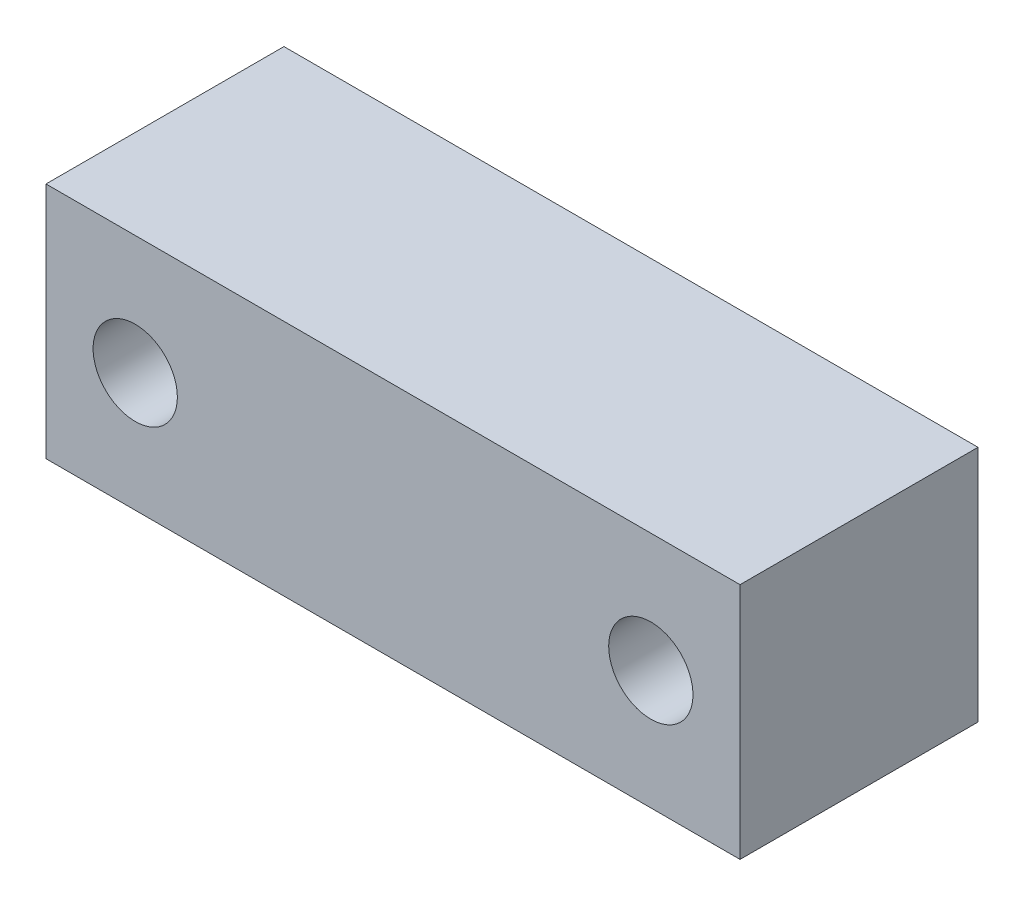
ISO-10303-21;
HEADER;
FILE_DESCRIPTION(('STEP AP214'),'2;1');
FILE_NAME('part.step','',(''),(''),'','','');
FILE_SCHEMA(('AUTOMOTIVE_DESIGN { 1 0 10303 214 1 1 1 1 }'));
ENDSEC;
DATA;
#1=APPLICATION_CONTEXT('core data for automotive mechanical design processes');
#2=APPLICATION_PROTOCOL_DEFINITION('international standard','automotive_design',2000,#1);
#3=PRODUCT_CONTEXT('',#1,'mechanical');
#4=PRODUCT('Part','Part','',(#3));
#5=PRODUCT_RELATED_PRODUCT_CATEGORY('part','',(#4));
#6=PRODUCT_DEFINITION_FORMATION('','',#4);
#7=PRODUCT_DEFINITION_CONTEXT('part definition',#1,'design');
#8=PRODUCT_DEFINITION('design','',#6,#7);
#9=PRODUCT_DEFINITION_SHAPE('','',#8);
#10=(LENGTH_UNIT() NAMED_UNIT(*) SI_UNIT(.MILLI.,.METRE.));
#11=(NAMED_UNIT(*) PLANE_ANGLE_UNIT() SI_UNIT($,.RADIAN.));
#12=(NAMED_UNIT(*) SI_UNIT($,.STERADIAN.) SOLID_ANGLE_UNIT());
#13=UNCERTAINTY_MEASURE_WITH_UNIT(LENGTH_MEASURE(1.E-05),#10,'distance_accuracy_value','');
#14=(GEOMETRIC_REPRESENTATION_CONTEXT(3) GLOBAL_UNCERTAINTY_ASSIGNED_CONTEXT((#13)) GLOBAL_UNIT_ASSIGNED_CONTEXT((#10,
#11,#12)) REPRESENTATION_CONTEXT('',''));
#15=CARTESIAN_POINT('',(0.,0.,0.));
#16=DIRECTION('',(0.,0.,1.));
#17=DIRECTION('',(1.,0.,0.));
#18=AXIS2_PLACEMENT_3D('',#15,#16,#17);
#19=CARTESIAN_POINT('',(0.,0.,24.));
#20=DIRECTION('',(1.,0.,0.));
#21=DIRECTION('',(0.,0.,-1.));
#22=AXIS2_PLACEMENT_3D('',#19,#20,#21);
#23=PLANE('',#22);
#24=DIRECTION('',(0.,-1.,0.));
#25=VECTOR('',#24,1.);
#26=CARTESIAN_POINT('',(0.,0.,0.));
#27=LINE('',#26,#25);
#28=CARTESIAN_POINT('',(0.,24.,0.));
#29=VERTEX_POINT('',#28);
#30=CARTESIAN_POINT('',(0.,0.,0.));
#31=VERTEX_POINT('',#30);
#32=EDGE_CURVE('E96',#29,#31,#27,.T.);
#33=ORIENTED_EDGE('',*,*,#32,.T.);
#34=DIRECTION('',(0.,0.,-1.));
#35=VECTOR('',#34,1.);
#36=CARTESIAN_POINT('',(0.,0.,24.));
#37=LINE('',#36,#35);
#38=CARTESIAN_POINT('',(0.,0.,24.));
#39=VERTEX_POINT('',#38);
#40=EDGE_CURVE('E11',#39,#31,#37,.T.);
#41=ORIENTED_EDGE('',*,*,#40,.F.);
#42=DIRECTION('',(0.,-1.,0.));
#43=VECTOR('',#42,1.);
#44=CARTESIAN_POINT('',(0.,0.,24.));
#45=LINE('',#44,#43);
#46=CARTESIAN_POINT('',(0.,24.,24.));
#47=VERTEX_POINT('',#46);
#48=EDGE_CURVE('E84',#47,#39,#45,.T.);
#49=ORIENTED_EDGE('',*,*,#48,.F.);
#50=DIRECTION('',(0.,0.,-1.));
#51=VECTOR('',#50,1.);
#52=CARTESIAN_POINT('',(0.,24.,24.));
#53=LINE('',#52,#51);
#54=EDGE_CURVE('E92',#47,#29,#53,.T.);
#55=ORIENTED_EDGE('',*,*,#54,.T.);
#56=EDGE_LOOP('',(#33,#41,#49,#55));
#57=FACE_BOUND('',#56,.T.);
#58=ADVANCED_FACE('F33',(#57),#23,.F.);
#59=CARTESIAN_POINT('',(0.,0.,24.));
#60=DIRECTION('',(0.,1.,0.));
#61=DIRECTION('',(0.,0.,1.));
#62=AXIS2_PLACEMENT_3D('',#59,#60,#61);
#63=PLANE('',#62);
#64=DIRECTION('',(1.,0.,0.));
#65=VECTOR('',#64,1.);
#66=CARTESIAN_POINT('',(0.,0.,0.));
#67=LINE('',#66,#65);
#68=CARTESIAN_POINT('',(70.,0.,0.));
#69=VERTEX_POINT('',#68);
#70=EDGE_CURVE('E88',#31,#69,#67,.T.);
#71=ORIENTED_EDGE('',*,*,#70,.T.);
#72=DIRECTION('',(0.,0.,-1.));
#73=VECTOR('',#72,1.);
#74=CARTESIAN_POINT('',(70.,0.,24.));
#75=LINE('',#74,#73);
#76=CARTESIAN_POINT('',(70.,0.,24.));
#77=VERTEX_POINT('',#76);
#78=EDGE_CURVE('E41',#77,#69,#75,.T.);
#79=ORIENTED_EDGE('',*,*,#78,.F.);
#80=DIRECTION('',(1.,0.,0.));
#81=VECTOR('',#80,1.);
#82=CARTESIAN_POINT('',(0.,0.,24.));
#83=LINE('',#82,#81);
#84=EDGE_CURVE('E79',#39,#77,#83,.T.);
#85=ORIENTED_EDGE('',*,*,#84,.F.);
#86=ORIENTED_EDGE('',*,*,#40,.T.);
#87=EDGE_LOOP('',(#71,#79,#85,#86));
#88=FACE_BOUND('',#87,.T.);
#89=ADVANCED_FACE('F87',(#88),#63,.F.);
#90=CARTESIAN_POINT('',(70.,0.,24.));
#91=DIRECTION('',(-1.,0.,0.));
#92=DIRECTION('',(0.,0.,1.));
#93=AXIS2_PLACEMENT_3D('',#90,#91,#92);
#94=PLANE('',#93);
#95=DIRECTION('',(0.,1.,0.));
#96=VECTOR('',#95,1.);
#97=CARTESIAN_POINT('',(70.,0.,0.));
#98=LINE('',#97,#96);
#99=CARTESIAN_POINT('',(70.,24.,0.));
#100=VERTEX_POINT('',#99);
#101=EDGE_CURVE('E66',#69,#100,#98,.T.);
#102=ORIENTED_EDGE('',*,*,#101,.T.);
#103=DIRECTION('',(0.,0.,-1.));
#104=VECTOR('',#103,1.);
#105=CARTESIAN_POINT('',(70.,24.,24.));
#106=LINE('',#105,#104);
#107=CARTESIAN_POINT('',(70.,24.,24.));
#108=VERTEX_POINT('',#107);
#109=EDGE_CURVE('E89',#108,#100,#106,.T.);
#110=ORIENTED_EDGE('',*,*,#109,.F.);
#111=DIRECTION('',(0.,1.,0.));
#112=VECTOR('',#111,1.);
#113=CARTESIAN_POINT('',(70.,0.,24.));
#114=LINE('',#113,#112);
#115=EDGE_CURVE('E82',#77,#108,#114,.T.);
#116=ORIENTED_EDGE('',*,*,#115,.F.);
#117=ORIENTED_EDGE('',*,*,#78,.T.);
#118=EDGE_LOOP('',(#102,#110,#116,#117));
#119=FACE_BOUND('',#118,.T.);
#120=ADVANCED_FACE('F90',(#119),#94,.F.);
#121=CARTESIAN_POINT('',(0.,24.,24.));
#122=DIRECTION('',(0.,-1.,0.));
#123=DIRECTION('',(0.,0.,-1.));
#124=AXIS2_PLACEMENT_3D('',#121,#122,#123);
#125=PLANE('',#124);
#126=DIRECTION('',(-1.,0.,0.));
#127=VECTOR('',#126,1.);
#128=CARTESIAN_POINT('',(0.,24.,0.));
#129=LINE('',#128,#127);
#130=EDGE_CURVE('E72',#100,#29,#129,.T.);
#131=ORIENTED_EDGE('',*,*,#130,.T.);
#132=ORIENTED_EDGE('',*,*,#54,.F.);
#133=DIRECTION('',(-1.,0.,0.));
#134=VECTOR('',#133,1.);
#135=CARTESIAN_POINT('',(0.,24.,24.));
#136=LINE('',#135,#134);
#137=EDGE_CURVE('E49',#108,#47,#136,.T.);
#138=ORIENTED_EDGE('',*,*,#137,.F.);
#139=ORIENTED_EDGE('',*,*,#109,.T.);
#140=EDGE_LOOP('',(#131,#132,#138,#139));
#141=FACE_BOUND('',#140,.T.);
#142=ADVANCED_FACE('F104',(#141),#125,.F.);
#143=CARTESIAN_POINT('',(0.,24.,24.));
#144=DIRECTION('',(0.,0.,-1.));
#145=DIRECTION('',(-1.,0.,0.));
#146=AXIS2_PLACEMENT_3D('',#143,#144,#145);
#147=PLANE('',#146);
#148=CARTESIAN_POINT('',(61.,12.,24.));
#149=DIRECTION('',(0.,0.,1.));
#150=DIRECTION('',(-1.,0.,0.));
#151=AXIS2_PLACEMENT_3D('',#148,#149,#150);
#152=CIRCLE('',#151,4.25000000000001);
#153=CARTESIAN_POINT('',(56.75,12.,24.));
#154=VERTEX_POINT('',#153);
#155=EDGE_CURVE('E116',#154,#154,#152,.T.);
#156=ORIENTED_EDGE('',*,*,#155,.F.);
#157=EDGE_LOOP('',(#156));
#158=FACE_BOUND('',#157,.T.);
#159=CARTESIAN_POINT('',(9.00000000000001,12.,24.));
#160=DIRECTION('',(0.,0.,1.));
#161=DIRECTION('',(1.,0.,0.));
#162=AXIS2_PLACEMENT_3D('',#159,#160,#161);
#163=CIRCLE('',#162,4.25);
#164=CARTESIAN_POINT('',(13.25,12.,24.));
#165=VERTEX_POINT('',#164);
#166=EDGE_CURVE('E110',#165,#165,#163,.T.);
#167=ORIENTED_EDGE('',*,*,#166,.F.);
#168=EDGE_LOOP('',(#167));
#169=FACE_BOUND('',#168,.T.);
#170=ORIENTED_EDGE('',*,*,#48,.T.);
#171=ORIENTED_EDGE('',*,*,#84,.T.);
#172=ORIENTED_EDGE('',*,*,#115,.T.);
#173=ORIENTED_EDGE('',*,*,#137,.T.);
#174=EDGE_LOOP('',(#170,#171,#172,#173));
#175=FACE_BOUND('',#174,.T.);
#176=ADVANCED_FACE('F80',(#158,#169,#175),#147,.F.);
#177=CARTESIAN_POINT('',(0.,24.,0.));
#178=DIRECTION('',(0.,0.,-1.));
#179=DIRECTION('',(-1.,0.,0.));
#180=AXIS2_PLACEMENT_3D('',#177,#178,#179);
#181=PLANE('',#180);
#182=CARTESIAN_POINT('',(61.,12.,0.));
#183=DIRECTION('',(0.,0.,1.));
#184=DIRECTION('',(-1.,0.,0.));
#185=AXIS2_PLACEMENT_3D('',#182,#183,#184);
#186=CIRCLE('',#185,4.25000000000001);
#187=CARTESIAN_POINT('',(56.75,12.,0.));
#188=VERTEX_POINT('',#187);
#189=EDGE_CURVE('E113',#188,#188,#186,.T.);
#190=ORIENTED_EDGE('',*,*,#189,.T.);
#191=EDGE_LOOP('',(#190));
#192=FACE_BOUND('',#191,.T.);
#193=CARTESIAN_POINT('',(9.00000000000001,12.,0.));
#194=DIRECTION('',(0.,0.,1.));
#195=DIRECTION('',(1.,0.,0.));
#196=AXIS2_PLACEMENT_3D('',#193,#194,#195);
#197=CIRCLE('',#196,4.25);
#198=CARTESIAN_POINT('',(13.25,12.,0.));
#199=VERTEX_POINT('',#198);
#200=EDGE_CURVE('E99',#199,#199,#197,.T.);
#201=ORIENTED_EDGE('',*,*,#200,.T.);
#202=EDGE_LOOP('',(#201));
#203=FACE_BOUND('',#202,.T.);
#204=ORIENTED_EDGE('',*,*,#32,.F.);
#205=ORIENTED_EDGE('',*,*,#130,.F.);
#206=ORIENTED_EDGE('',*,*,#101,.F.);
#207=ORIENTED_EDGE('',*,*,#70,.F.);
#208=EDGE_LOOP('',(#204,#205,#206,#207));
#209=FACE_BOUND('',#208,.T.);
#210=ADVANCED_FACE('F107',(#192,#203,#209),#181,.T.);
#211=CARTESIAN_POINT('',(9.00000000000001,12.,0.));
#212=DIRECTION('',(0.,0.,1.));
#213=DIRECTION('',(1.,0.,0.));
#214=AXIS2_PLACEMENT_3D('',#211,#212,#213);
#215=CYLINDRICAL_SURFACE('',#214,4.25);
#216=ORIENTED_EDGE('',*,*,#200,.F.);
#217=EDGE_LOOP('',(#216));
#218=FACE_BOUND('',#217,.T.);
#219=ORIENTED_EDGE('',*,*,#166,.T.);
#220=EDGE_LOOP('',(#219));
#221=FACE_BOUND('',#220,.T.);
#222=ADVANCED_FACE('F127',(#218,#221),#215,.F.);
#223=CARTESIAN_POINT('',(61.,12.,0.));
#224=DIRECTION('',(0.,0.,1.));
#225=DIRECTION('',(1.,0.,0.));
#226=AXIS2_PLACEMENT_3D('',#223,#224,#225);
#227=CYLINDRICAL_SURFACE('',#226,4.25000000000001);
#228=ORIENTED_EDGE('',*,*,#189,.F.);
#229=EDGE_LOOP('',(#228));
#230=FACE_BOUND('',#229,.T.);
#231=ORIENTED_EDGE('',*,*,#155,.T.);
#232=EDGE_LOOP('',(#231));
#233=FACE_BOUND('',#232,.T.);
#234=ADVANCED_FACE('F124',(#230,#233),#227,.F.);
#235=CLOSED_SHELL('',(#58,#89,#120,#142,#176,#210,#222,#234));
#236=MANIFOLD_SOLID_BREP('B2',#235);
#237=ADVANCED_BREP_SHAPE_REPRESENTATION('',(#18,#236),#14);
#238=SHAPE_DEFINITION_REPRESENTATION(#9,#237);
ENDSEC;
END-ISO-10303-21;
